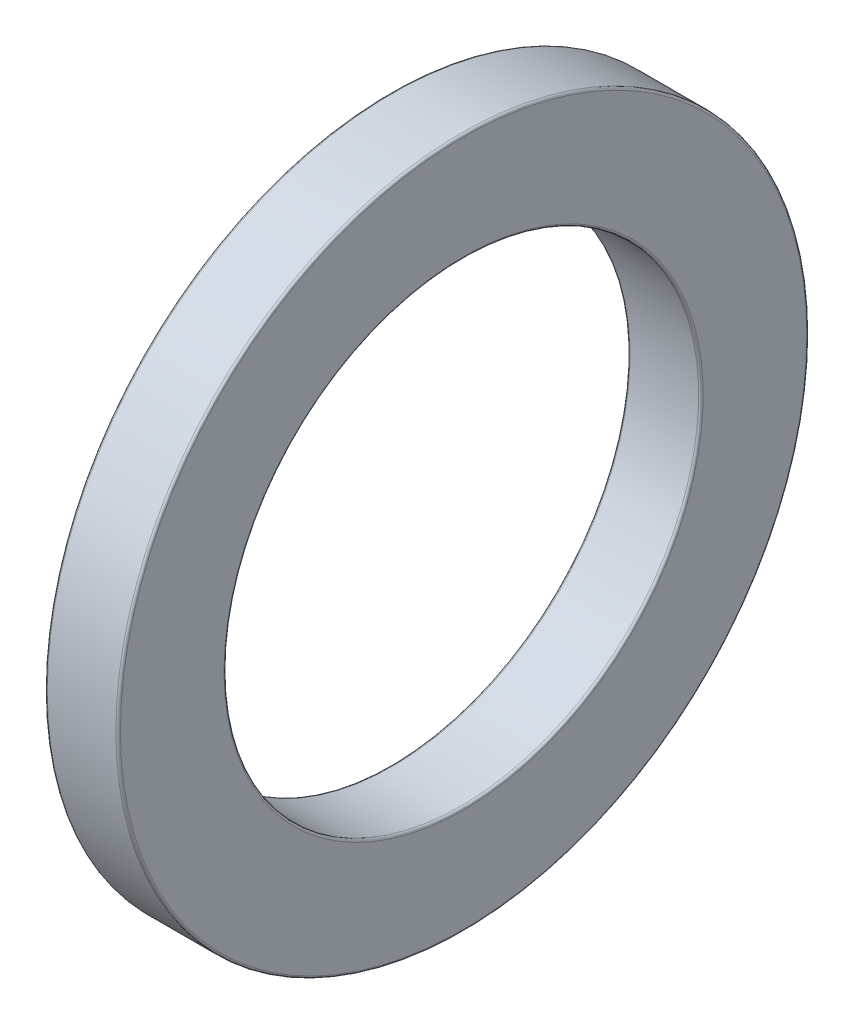
ISO-10303-21;
HEADER;
FILE_DESCRIPTION(('STEP AP214'),'2;1');
FILE_NAME('part.step','',(''),(''),'','','');
FILE_SCHEMA(('AUTOMOTIVE_DESIGN { 1 0 10303 214 1 1 1 1 }'));
ENDSEC;
DATA;
#1=APPLICATION_CONTEXT('core data for automotive mechanical design processes');
#2=APPLICATION_PROTOCOL_DEFINITION('international standard','automotive_design',2000,#1);
#3=PRODUCT_CONTEXT('',#1,'mechanical');
#4=PRODUCT('Part','Part','',(#3));
#5=PRODUCT_RELATED_PRODUCT_CATEGORY('part','',(#4));
#6=PRODUCT_DEFINITION_FORMATION('','',#4);
#7=PRODUCT_DEFINITION_CONTEXT('part definition',#1,'design');
#8=PRODUCT_DEFINITION('design','',#6,#7);
#9=PRODUCT_DEFINITION_SHAPE('','',#8);
#10=(LENGTH_UNIT() NAMED_UNIT(*) SI_UNIT(.MILLI.,.METRE.));
#11=(NAMED_UNIT(*) PLANE_ANGLE_UNIT() SI_UNIT($,.RADIAN.));
#12=(NAMED_UNIT(*) SI_UNIT($,.STERADIAN.) SOLID_ANGLE_UNIT());
#13=UNCERTAINTY_MEASURE_WITH_UNIT(LENGTH_MEASURE(1.E-05),#10,'distance_accuracy_value','');
#14=(GEOMETRIC_REPRESENTATION_CONTEXT(3) GLOBAL_UNCERTAINTY_ASSIGNED_CONTEXT((#13)) GLOBAL_UNIT_ASSIGNED_CONTEXT((#10,
#11,#12)) REPRESENTATION_CONTEXT('',''));
#15=CARTESIAN_POINT('',(0.,0.,0.));
#16=DIRECTION('',(0.,0.,1.));
#17=DIRECTION('',(1.,0.,0.));
#18=AXIS2_PLACEMENT_3D('',#15,#16,#17);
#19=CARTESIAN_POINT('',(-1.505,0.,0.));
#20=DIRECTION('',(-1.,0.,0.));
#21=DIRECTION('',(0.,0.,1.));
#22=AXIS2_PLACEMENT_3D('',#19,#20,#21);
#23=TOROIDAL_SURFACE('',#22,10.51,0.0999999999999997);
#24=CARTESIAN_POINT('',(-1.505,0.,0.));
#25=DIRECTION('',(-1.,0.,0.));
#26=DIRECTION('',(0.,0.,1.));
#27=AXIS2_PLACEMENT_3D('',#24,#25,#26);
#28=CIRCLE('',#27,10.41);
#29=CARTESIAN_POINT('',(-1.505,0.,10.41));
#30=VERTEX_POINT('',#29);
#31=EDGE_CURVE('E10',#30,#30,#28,.T.);
#32=ORIENTED_EDGE('',*,*,#31,.F.);
#33=EDGE_LOOP('',(#32));
#34=FACE_BOUND('',#33,.T.);
#35=CARTESIAN_POINT('',(-1.605,0.,0.));
#36=DIRECTION('',(-1.,0.,0.));
#37=DIRECTION('',(0.,0.,1.));
#38=AXIS2_PLACEMENT_3D('',#35,#36,#37);
#39=CIRCLE('',#38,10.51);
#40=CARTESIAN_POINT('',(-1.605,0.,10.51));
#41=VERTEX_POINT('',#40);
#42=EDGE_CURVE('E38',#41,#41,#39,.T.);
#43=ORIENTED_EDGE('',*,*,#42,.T.);
#44=EDGE_LOOP('',(#43));
#45=FACE_BOUND('',#44,.T.);
#46=ADVANCED_FACE('F32',(#34,#45),#23,.T.);
#47=CARTESIAN_POINT('',(-1.605,0.,-15.05));
#48=DIRECTION('',(1.,0.,0.));
#49=DIRECTION('',(0.,0.,-1.));
#50=AXIS2_PLACEMENT_3D('',#47,#48,#49);
#51=PLANE('',#50);
#52=ORIENTED_EDGE('',*,*,#42,.F.);
#53=EDGE_LOOP('',(#52));
#54=FACE_BOUND('',#53,.T.);
#55=CARTESIAN_POINT('',(-1.605,0.,0.));
#56=DIRECTION('',(-1.,0.,0.));
#57=DIRECTION('',(0.,0.,1.));
#58=AXIS2_PLACEMENT_3D('',#55,#56,#57);
#59=CIRCLE('',#58,15.05);
#60=CARTESIAN_POINT('',(-1.605,0.,15.05));
#61=VERTEX_POINT('',#60);
#62=EDGE_CURVE('E42',#61,#61,#59,.T.);
#63=ORIENTED_EDGE('',*,*,#62,.T.);
#64=EDGE_LOOP('',(#63));
#65=FACE_BOUND('',#64,.T.);
#66=ADVANCED_FACE('F76',(#54,#65),#51,.F.);
#67=CARTESIAN_POINT('',(-1.505,0.,0.));
#68=DIRECTION('',(-1.,0.,0.));
#69=DIRECTION('',(0.,0.,1.));
#70=AXIS2_PLACEMENT_3D('',#67,#68,#69);
#71=TOROIDAL_SURFACE('',#70,15.05,0.0999999999999998);
#72=ORIENTED_EDGE('',*,*,#62,.F.);
#73=EDGE_LOOP('',(#72));
#74=FACE_BOUND('',#73,.T.);
#75=CARTESIAN_POINT('',(-1.505,0.,0.));
#76=DIRECTION('',(-1.,0.,0.));
#77=DIRECTION('',(0.,0.,1.));
#78=AXIS2_PLACEMENT_3D('',#75,#76,#77);
#79=CIRCLE('',#78,15.15);
#80=CARTESIAN_POINT('',(-1.505,0.,15.15));
#81=VERTEX_POINT('',#80);
#82=EDGE_CURVE('E46',#81,#81,#79,.T.);
#83=ORIENTED_EDGE('',*,*,#82,.T.);
#84=EDGE_LOOP('',(#83));
#85=FACE_BOUND('',#84,.T.);
#86=ADVANCED_FACE('F81',(#74,#85),#71,.T.);
#87=CARTESIAN_POINT('',(0.,0.,0.));
#88=DIRECTION('',(-1.,0.,0.));
#89=DIRECTION('',(0.,0.,1.));
#90=AXIS2_PLACEMENT_3D('',#87,#88,#89);
#91=CYLINDRICAL_SURFACE('',#90,15.15);
#92=ORIENTED_EDGE('',*,*,#82,.F.);
#93=EDGE_LOOP('',(#92));
#94=FACE_BOUND('',#93,.T.);
#95=CARTESIAN_POINT('',(1.505,0.,0.));
#96=DIRECTION('',(-1.,0.,0.));
#97=DIRECTION('',(0.,0.,1.));
#98=AXIS2_PLACEMENT_3D('',#95,#96,#97);
#99=CIRCLE('',#98,15.15);
#100=CARTESIAN_POINT('',(1.505,0.,15.15));
#101=VERTEX_POINT('',#100);
#102=EDGE_CURVE('E51',#101,#101,#99,.T.);
#103=ORIENTED_EDGE('',*,*,#102,.T.);
#104=EDGE_LOOP('',(#103));
#105=FACE_BOUND('',#104,.T.);
#106=ADVANCED_FACE('F86',(#94,#105),#91,.T.);
#107=CARTESIAN_POINT('',(1.505,0.,0.));
#108=DIRECTION('',(-1.,0.,0.));
#109=DIRECTION('',(0.,0.,1.));
#110=AXIS2_PLACEMENT_3D('',#107,#108,#109);
#111=TOROIDAL_SURFACE('',#110,15.05,0.0999999999999997);
#112=ORIENTED_EDGE('',*,*,#102,.F.);
#113=EDGE_LOOP('',(#112));
#114=FACE_BOUND('',#113,.T.);
#115=CARTESIAN_POINT('',(1.605,0.,0.));
#116=DIRECTION('',(-1.,0.,0.));
#117=DIRECTION('',(0.,0.,1.));
#118=AXIS2_PLACEMENT_3D('',#115,#116,#117);
#119=CIRCLE('',#118,15.05);
#120=CARTESIAN_POINT('',(1.605,0.,15.05));
#121=VERTEX_POINT('',#120);
#122=EDGE_CURVE('E54',#121,#121,#119,.T.);
#123=ORIENTED_EDGE('',*,*,#122,.T.);
#124=EDGE_LOOP('',(#123));
#125=FACE_BOUND('',#124,.T.);
#126=ADVANCED_FACE('F93',(#114,#125),#111,.T.);
#127=CARTESIAN_POINT('',(1.605,0.,-10.51));
#128=DIRECTION('',(-1.,0.,0.));
#129=DIRECTION('',(0.,0.,1.));
#130=AXIS2_PLACEMENT_3D('',#127,#128,#129);
#131=PLANE('',#130);
#132=ORIENTED_EDGE('',*,*,#122,.F.);
#133=EDGE_LOOP('',(#132));
#134=FACE_BOUND('',#133,.T.);
#135=CARTESIAN_POINT('',(1.605,0.,0.));
#136=DIRECTION('',(-1.,0.,0.));
#137=DIRECTION('',(0.,0.,1.));
#138=AXIS2_PLACEMENT_3D('',#135,#136,#137);
#139=CIRCLE('',#138,10.51);
#140=CARTESIAN_POINT('',(1.605,0.,10.51));
#141=VERTEX_POINT('',#140);
#142=EDGE_CURVE('E57',#141,#141,#139,.T.);
#143=ORIENTED_EDGE('',*,*,#142,.T.);
#144=EDGE_LOOP('',(#143));
#145=FACE_BOUND('',#144,.T.);
#146=ADVANCED_FACE('F72',(#134,#145),#131,.F.);
#147=CARTESIAN_POINT('',(1.505,0.,0.));
#148=DIRECTION('',(-1.,0.,0.));
#149=DIRECTION('',(0.,0.,1.));
#150=AXIS2_PLACEMENT_3D('',#147,#148,#149);
#151=TOROIDAL_SURFACE('',#150,10.51,0.0999999999999997);
#152=ORIENTED_EDGE('',*,*,#142,.F.);
#153=EDGE_LOOP('',(#152));
#154=FACE_BOUND('',#153,.T.);
#155=CARTESIAN_POINT('',(1.505,0.,0.));
#156=DIRECTION('',(-1.,0.,0.));
#157=DIRECTION('',(0.,0.,1.));
#158=AXIS2_PLACEMENT_3D('',#155,#156,#157);
#159=CIRCLE('',#158,10.41);
#160=CARTESIAN_POINT('',(1.505,0.,10.41));
#161=VERTEX_POINT('',#160);
#162=EDGE_CURVE('E60',#161,#161,#159,.T.);
#163=ORIENTED_EDGE('',*,*,#162,.T.);
#164=EDGE_LOOP('',(#163));
#165=FACE_BOUND('',#164,.T.);
#166=ADVANCED_FACE('F64',(#154,#165),#151,.T.);
#167=CARTESIAN_POINT('',(0.,0.,0.));
#168=DIRECTION('',(-1.,0.,0.));
#169=DIRECTION('',(0.,0.,1.));
#170=AXIS2_PLACEMENT_3D('',#167,#168,#169);
#171=CYLINDRICAL_SURFACE('',#170,10.41);
#172=ORIENTED_EDGE('',*,*,#162,.F.);
#173=EDGE_LOOP('',(#172));
#174=FACE_BOUND('',#173,.T.);
#175=ORIENTED_EDGE('',*,*,#31,.T.);
#176=EDGE_LOOP('',(#175));
#177=FACE_BOUND('',#176,.T.);
#178=ADVANCED_FACE('F66',(#174,#177),#171,.F.);
#179=CLOSED_SHELL('',(#46,#66,#86,#106,#126,#146,#166,#178));
#180=MANIFOLD_SOLID_BREP('B2',#179);
#181=ADVANCED_BREP_SHAPE_REPRESENTATION('',(#18,#180),#14);
#182=SHAPE_DEFINITION_REPRESENTATION(#9,#181);
ENDSEC;
END-ISO-10303-21;
